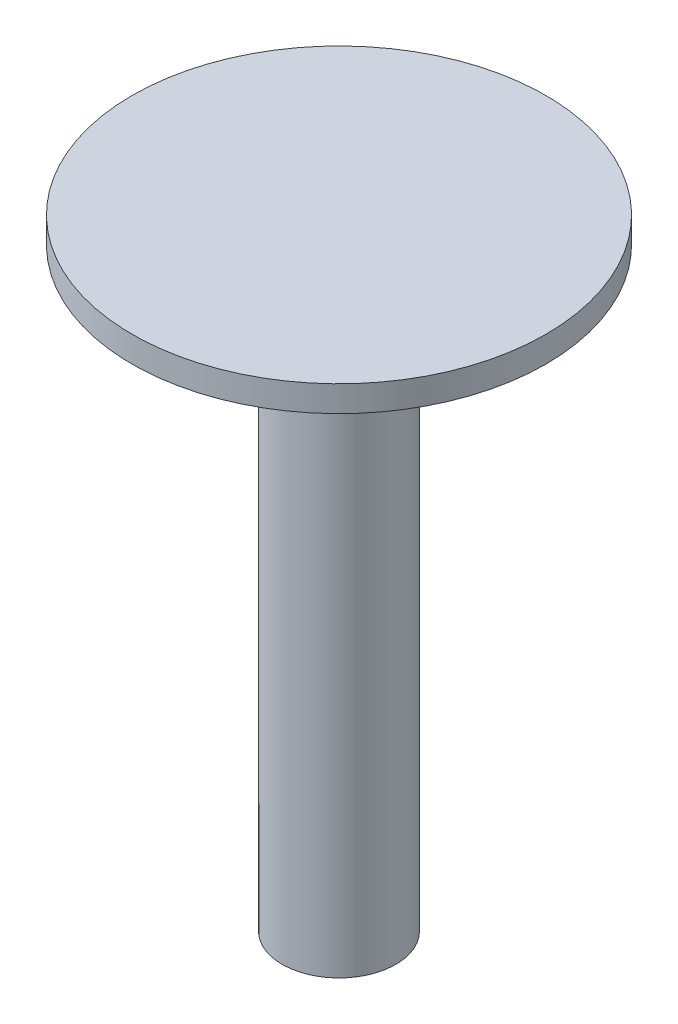
ISO-10303-21;
HEADER;
FILE_DESCRIPTION(('STEP AP214'),'2;1');
FILE_NAME('part.step','',(''),(''),'','','');
FILE_SCHEMA(('AUTOMOTIVE_DESIGN { 1 0 10303 214 1 1 1 1 }'));
ENDSEC;
DATA;
#1=APPLICATION_CONTEXT('core data for automotive mechanical design processes');
#2=APPLICATION_PROTOCOL_DEFINITION('international standard','automotive_design',2000,#1);
#3=PRODUCT_CONTEXT('',#1,'mechanical');
#4=PRODUCT('Part','Part','',(#3));
#5=PRODUCT_RELATED_PRODUCT_CATEGORY('part','',(#4));
#6=PRODUCT_DEFINITION_FORMATION('','',#4);
#7=PRODUCT_DEFINITION_CONTEXT('part definition',#1,'design');
#8=PRODUCT_DEFINITION('design','',#6,#7);
#9=PRODUCT_DEFINITION_SHAPE('','',#8);
#10=(LENGTH_UNIT() NAMED_UNIT(*) SI_UNIT(.MILLI.,.METRE.));
#11=(NAMED_UNIT(*) PLANE_ANGLE_UNIT() SI_UNIT($,.RADIAN.));
#12=(NAMED_UNIT(*) SI_UNIT($,.STERADIAN.) SOLID_ANGLE_UNIT());
#13=UNCERTAINTY_MEASURE_WITH_UNIT(LENGTH_MEASURE(1.E-05),#10,'distance_accuracy_value','');
#14=(GEOMETRIC_REPRESENTATION_CONTEXT(3) GLOBAL_UNCERTAINTY_ASSIGNED_CONTEXT((#13)) GLOBAL_UNIT_ASSIGNED_CONTEXT((#10,
#11,#12)) REPRESENTATION_CONTEXT('',''));
#15=CARTESIAN_POINT('',(0.,0.,0.));
#16=DIRECTION('',(0.,0.,1.));
#17=DIRECTION('',(1.,0.,0.));
#18=AXIS2_PLACEMENT_3D('',#15,#16,#17);
#19=CARTESIAN_POINT('',(0.,120.,0.));
#20=DIRECTION('',(0.,-1.,0.));
#21=DIRECTION('',(1.,0.,0.));
#22=AXIS2_PLACEMENT_3D('',#19,#20,#21);
#23=PLANE('',#22);
#24=CARTESIAN_POINT('',(0.,120.,0.));
#25=DIRECTION('',(0.,1.,0.));
#26=DIRECTION('',(-1.,0.,0.));
#27=AXIS2_PLACEMENT_3D('',#24,#25,#26);
#28=CIRCLE('',#27,40.);
#29=CARTESIAN_POINT('',(-40.,120.,0.));
#30=VERTEX_POINT('',#29);
#31=EDGE_CURVE('E52',#30,#30,#28,.T.);
#32=ORIENTED_EDGE('',*,*,#31,.T.);
#33=EDGE_LOOP('',(#32));
#34=FACE_BOUND('',#33,.T.);
#35=ADVANCED_FACE('F41',(#34),#23,.F.);
#36=CARTESIAN_POINT('',(0.,120.,0.));
#37=DIRECTION('',(0.,1.,0.));
#38=DIRECTION('',(-1.,0.,0.));
#39=AXIS2_PLACEMENT_3D('',#36,#37,#38);
#40=CYLINDRICAL_SURFACE('',#39,40.);
#41=ORIENTED_EDGE('',*,*,#31,.F.);
#42=EDGE_LOOP('',(#41));
#43=FACE_BOUND('',#42,.T.);
#44=CARTESIAN_POINT('',(0.,115.,0.));
#45=DIRECTION('',(0.,1.,0.));
#46=DIRECTION('',(-1.,0.,0.));
#47=AXIS2_PLACEMENT_3D('',#44,#45,#46);
#48=CIRCLE('',#47,40.);
#49=CARTESIAN_POINT('',(-40.,115.,0.));
#50=VERTEX_POINT('',#49);
#51=EDGE_CURVE('E56',#50,#50,#48,.T.);
#52=ORIENTED_EDGE('',*,*,#51,.T.);
#53=EDGE_LOOP('',(#52));
#54=FACE_BOUND('',#53,.T.);
#55=ADVANCED_FACE('F80',(#43,#54),#40,.T.);
#56=CARTESIAN_POINT('',(40.,115.,0.));
#57=DIRECTION('',(0.,1.,0.));
#58=DIRECTION('',(-1.,0.,0.));
#59=AXIS2_PLACEMENT_3D('',#56,#57,#58);
#60=PLANE('',#59);
#61=CARTESIAN_POINT('',(0.,115.,0.));
#62=DIRECTION('',(0.,1.,0.));
#63=DIRECTION('',(-1.,0.,0.));
#64=AXIS2_PLACEMENT_3D('',#61,#62,#63);
#65=CIRCLE('',#64,13.);
#66=CARTESIAN_POINT('',(-13.,115.,0.));
#67=VERTEX_POINT('',#66);
#68=EDGE_CURVE('E48',#67,#67,#65,.T.);
#69=ORIENTED_EDGE('',*,*,#68,.T.);
#70=EDGE_LOOP('',(#69));
#71=FACE_BOUND('',#70,.T.);
#72=ORIENTED_EDGE('',*,*,#51,.F.);
#73=EDGE_LOOP('',(#72));
#74=FACE_BOUND('',#73,.T.);
#75=ADVANCED_FACE('F77',(#71,#74),#60,.F.);
#76=CARTESIAN_POINT('',(0.,120.,0.));
#77=DIRECTION('',(0.,1.,0.));
#78=DIRECTION('',(-1.,0.,0.));
#79=AXIS2_PLACEMENT_3D('',#76,#77,#78);
#80=CYLINDRICAL_SURFACE('',#79,11.);
#81=CARTESIAN_POINT('',(0.,113.,0.));
#82=DIRECTION('',(0.,1.,0.));
#83=DIRECTION('',(-1.,0.,0.));
#84=AXIS2_PLACEMENT_3D('',#81,#82,#83);
#85=CIRCLE('',#84,11.);
#86=CARTESIAN_POINT('',(-11.,113.,0.));
#87=VERTEX_POINT('',#86);
#88=EDGE_CURVE('E10',#87,#87,#85,.F.);
#89=ORIENTED_EDGE('',*,*,#88,.T.);
#90=EDGE_LOOP('',(#89));
#91=FACE_BOUND('',#90,.T.);
#92=CARTESIAN_POINT('',(0.,0.,0.));
#93=DIRECTION('',(0.,1.,0.));
#94=DIRECTION('',(-1.,0.,0.));
#95=AXIS2_PLACEMENT_3D('',#92,#93,#94);
#96=CIRCLE('',#95,11.);
#97=CARTESIAN_POINT('',(-11.,0.,0.));
#98=VERTEX_POINT('',#97);
#99=EDGE_CURVE('E61',#98,#98,#96,.T.);
#100=ORIENTED_EDGE('',*,*,#99,.T.);
#101=EDGE_LOOP('',(#100));
#102=FACE_BOUND('',#101,.T.);
#103=ADVANCED_FACE('F65',(#91,#102),#80,.T.);
#104=CARTESIAN_POINT('',(11.,0.,0.));
#105=DIRECTION('',(0.,1.,0.));
#106=DIRECTION('',(-1.,0.,0.));
#107=AXIS2_PLACEMENT_3D('',#104,#105,#106);
#108=PLANE('',#107);
#109=ORIENTED_EDGE('',*,*,#99,.F.);
#110=EDGE_LOOP('',(#109));
#111=FACE_BOUND('',#110,.T.);
#112=ADVANCED_FACE('F67',(#111),#108,.F.);
#113=CARTESIAN_POINT('',(0.,113.,0.));
#114=DIRECTION('',(0.,1.,0.));
#115=DIRECTION('',(-1.,0.,0.));
#116=AXIS2_PLACEMENT_3D('',#113,#114,#115);
#117=TOROIDAL_SURFACE('',#116,13.,2.);
#118=ORIENTED_EDGE('',*,*,#88,.F.);
#119=EDGE_LOOP('',(#118));
#120=FACE_BOUND('',#119,.T.);
#121=ORIENTED_EDGE('',*,*,#68,.F.);
#122=EDGE_LOOP('',(#121));
#123=FACE_BOUND('',#122,.T.);
#124=ADVANCED_FACE('F43',(#120,#123),#117,.F.);
#125=CLOSED_SHELL('',(#35,#55,#75,#103,#112,#124));
#126=MANIFOLD_SOLID_BREP('B2',#125);
#127=ADVANCED_BREP_SHAPE_REPRESENTATION('',(#18,#126),#14);
#128=SHAPE_DEFINITION_REPRESENTATION(#9,#127);
ENDSEC;
END-ISO-10303-21;
